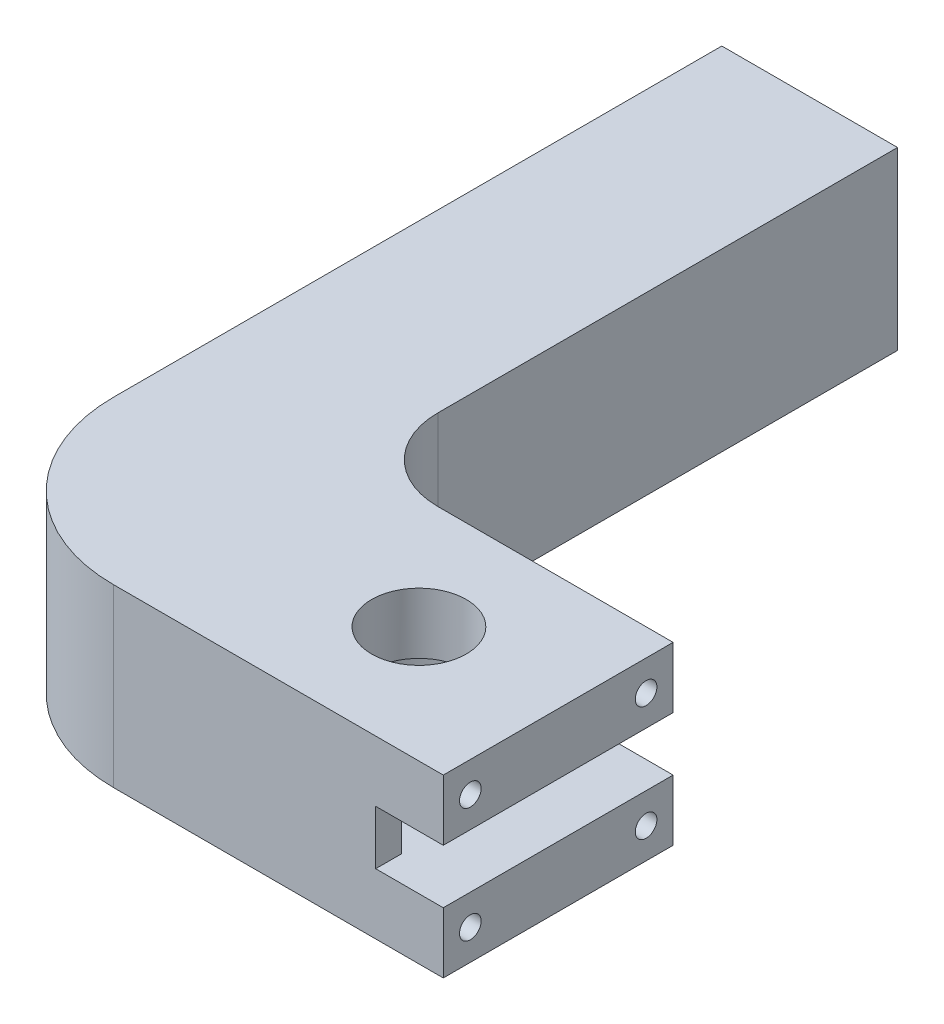
ISO-10303-21;
HEADER;
FILE_DESCRIPTION(('STEP AP214'),'2;1');
FILE_NAME('part.step','',(''),(''),'','','');
FILE_SCHEMA(('AUTOMOTIVE_DESIGN { 1 0 10303 214 1 1 1 1 }'));
ENDSEC;
DATA;
#1=APPLICATION_CONTEXT('core data for automotive mechanical design processes');
#2=APPLICATION_PROTOCOL_DEFINITION('international standard','automotive_design',2000,#1);
#3=PRODUCT_CONTEXT('',#1,'mechanical');
#4=PRODUCT('Part','Part','',(#3));
#5=PRODUCT_RELATED_PRODUCT_CATEGORY('part','',(#4));
#6=PRODUCT_DEFINITION_FORMATION('','',#4);
#7=PRODUCT_DEFINITION_CONTEXT('part definition',#1,'design');
#8=PRODUCT_DEFINITION('design','',#6,#7);
#9=PRODUCT_DEFINITION_SHAPE('','',#8);
#10=(LENGTH_UNIT() NAMED_UNIT(*) SI_UNIT(.MILLI.,.METRE.));
#11=(NAMED_UNIT(*) PLANE_ANGLE_UNIT() SI_UNIT($,.RADIAN.));
#12=(NAMED_UNIT(*) SI_UNIT($,.STERADIAN.) SOLID_ANGLE_UNIT());
#13=UNCERTAINTY_MEASURE_WITH_UNIT(LENGTH_MEASURE(1.E-05),#10,'distance_accuracy_value','');
#14=(GEOMETRIC_REPRESENTATION_CONTEXT(3) GLOBAL_UNCERTAINTY_ASSIGNED_CONTEXT((#13)) GLOBAL_UNIT_ASSIGNED_CONTEXT((#10,
#11,#12)) REPRESENTATION_CONTEXT('',''));
#15=CARTESIAN_POINT('',(0.,0.,0.));
#16=DIRECTION('',(0.,0.,1.));
#17=DIRECTION('',(1.,0.,0.));
#18=AXIS2_PLACEMENT_3D('',#15,#16,#17);
#19=CARTESIAN_POINT('',(3987.8,1.11022302462516E-13,7239.));
#20=DIRECTION('',(1.,0.,0.));
#21=DIRECTION('',(0.,0.,-1.));
#22=AXIS2_PLACEMENT_3D('',#19,#20,#21);
#23=PLANE('',#22);
#24=DIRECTION('',(0.,1.,0.));
#25=VECTOR('',#24,1.);
#26=CARTESIAN_POINT('',(3987.8,1.11022302462516E-13,5080.));
#27=LINE('',#26,#25);
#28=CARTESIAN_POINT('',(3987.8,571.5,5080.));
#29=VERTEX_POINT('',#28);
#30=CARTESIAN_POINT('',(3987.8,1079.5,5080.));
#31=VERTEX_POINT('',#30);
#32=EDGE_CURVE('E277',#29,#31,#27,.T.);
#33=ORIENTED_EDGE('',*,*,#32,.T.);
#34=DIRECTION('',(0.,0.,-1.));
#35=VECTOR('',#34,1.);
#36=CARTESIAN_POINT('',(3987.8,1079.5,5080.));
#37=LINE('',#36,#35);
#38=CARTESIAN_POINT('',(3987.8,1079.5,5321.3));
#39=VERTEX_POINT('',#38);
#40=EDGE_CURVE('E192',#39,#31,#37,.T.);
#41=ORIENTED_EDGE('',*,*,#40,.F.);
#42=DIRECTION('',(0.,-1.,0.));
#43=VECTOR('',#42,1.);
#44=CARTESIAN_POINT('',(3987.8,1079.5,5321.3));
#45=LINE('',#44,#43);
#46=CARTESIAN_POINT('',(3987.8,571.5,5321.3));
#47=VERTEX_POINT('',#46);
#48=EDGE_CURVE('E261',#39,#47,#45,.T.);
#49=ORIENTED_EDGE('',*,*,#48,.T.);
#50=DIRECTION('',(0.,0.,1.));
#51=VECTOR('',#50,1.);
#52=CARTESIAN_POINT('',(3987.8,571.5,7239.));
#53=LINE('',#52,#51);
#54=EDGE_CURVE('E212',#29,#47,#53,.T.);
#55=ORIENTED_EDGE('',*,*,#54,.F.);
#56=EDGE_LOOP('',(#33,#41,#49,#55));
#57=FACE_BOUND('',#56,.T.);
#58=ADVANCED_FACE('F36',(#57),#23,.T.);
#59=DIRECTION('',(0.,-1.,0.));
#60=VECTOR('',#59,1.);
#61=CARTESIAN_POINT('',(3987.8,1079.5,6997.7));
#62=LINE('',#61,#60);
#63=CARTESIAN_POINT('',(3987.8,1079.5,6997.7));
#64=VERTEX_POINT('',#63);
#65=CARTESIAN_POINT('',(3987.8,571.5,6997.7));
#66=VERTEX_POINT('',#65);
#67=EDGE_CURVE('E232',#64,#66,#62,.T.);
#68=ORIENTED_EDGE('',*,*,#67,.F.);
#69=CARTESIAN_POINT('',(3987.8,1079.5,7239.));
#70=VERTEX_POINT('',#69);
#71=EDGE_CURVE('E197',#70,#64,#37,.T.);
#72=ORIENTED_EDGE('',*,*,#71,.F.);
#73=DIRECTION('',(0.,1.,0.));
#74=VECTOR('',#73,1.);
#75=CARTESIAN_POINT('',(3987.8,1.11022302462516E-13,7239.));
#76=LINE('',#75,#74);
#77=CARTESIAN_POINT('',(3987.8,571.5,7239.));
#78=VERTEX_POINT('',#77);
#79=EDGE_CURVE('E163',#78,#70,#76,.T.);
#80=ORIENTED_EDGE('',*,*,#79,.F.);
#81=EDGE_CURVE('E226',#66,#78,#53,.T.);
#82=ORIENTED_EDGE('',*,*,#81,.F.);
#83=EDGE_LOOP('',(#68,#72,#80,#82));
#84=FACE_BOUND('',#83,.T.);
#85=ADVANCED_FACE('F318',(#84),#23,.T.);
#86=CARTESIAN_POINT('',(0.,1.11022302462516E-13,7239.));
#87=DIRECTION('',(0.,0.,1.));
#88=DIRECTION('',(1.,0.,0.));
#89=AXIS2_PLACEMENT_3D('',#86,#87,#88);
#90=PLANE('',#89);
#91=DIRECTION('',(1.,0.,0.));
#92=VECTOR('',#91,1.);
#93=CARTESIAN_POINT('',(3987.8,1651.,7239.));
#94=LINE('',#93,#92);
#95=CARTESIAN_POINT('',(1524.,1651.,7239.));
#96=VERTEX_POINT('',#95);
#97=CARTESIAN_POINT('',(4622.8,1651.,7239.));
#98=VERTEX_POINT('',#97);
#99=EDGE_CURVE('E252',#96,#98,#94,.T.);
#100=ORIENTED_EDGE('',*,*,#99,.F.);
#101=DIRECTION('',(0.,1.,0.));
#102=VECTOR('',#101,1.);
#103=CARTESIAN_POINT('',(1524.,1.11022302462516E-13,7239.));
#104=LINE('',#103,#102);
#105=CARTESIAN_POINT('',(1524.,1.11022302462516E-13,7239.));
#106=VERTEX_POINT('',#105);
#107=EDGE_CURVE('E44',#96,#106,#104,.F.);
#108=ORIENTED_EDGE('',*,*,#107,.T.);
#109=DIRECTION('',(1.,0.,0.));
#110=VECTOR('',#109,1.);
#111=CARTESIAN_POINT('',(0.,1.11022302462516E-13,7239.));
#112=LINE('',#111,#110);
#113=CARTESIAN_POINT('',(4622.8,0.,7239.));
#114=VERTEX_POINT('',#113);
#115=EDGE_CURVE('E273',#106,#114,#112,.T.);
#116=ORIENTED_EDGE('',*,*,#115,.T.);
#117=DIRECTION('',(0.,-1.,0.));
#118=VECTOR('',#117,1.);
#119=CARTESIAN_POINT('',(4622.8,0.,7239.));
#120=LINE('',#119,#118);
#121=CARTESIAN_POINT('',(4622.8,571.5,7239.));
#122=VERTEX_POINT('',#121);
#123=EDGE_CURVE('E213',#122,#114,#120,.T.);
#124=ORIENTED_EDGE('',*,*,#123,.F.);
#125=DIRECTION('',(-1.,0.,0.));
#126=VECTOR('',#125,1.);
#127=CARTESIAN_POINT('',(4622.8,571.5,7239.));
#128=LINE('',#127,#126);
#129=EDGE_CURVE('E223',#122,#78,#128,.T.);
#130=ORIENTED_EDGE('',*,*,#129,.T.);
#131=ORIENTED_EDGE('',*,*,#79,.T.);
#132=DIRECTION('',(-1.,0.,0.));
#133=VECTOR('',#132,1.);
#134=CARTESIAN_POINT('',(4622.8,1079.5,7239.));
#135=LINE('',#134,#133);
#136=CARTESIAN_POINT('',(4622.8,1079.5,7239.));
#137=VERTEX_POINT('',#136);
#138=EDGE_CURVE('E209',#137,#70,#135,.T.);
#139=ORIENTED_EDGE('',*,*,#138,.F.);
#140=DIRECTION('',(0.,-1.,0.));
#141=VECTOR('',#140,1.);
#142=CARTESIAN_POINT('',(4622.8,1079.5,7239.));
#143=LINE('',#142,#141);
#144=EDGE_CURVE('E200',#98,#137,#143,.T.);
#145=ORIENTED_EDGE('',*,*,#144,.F.);
#146=EDGE_LOOP('',(#100,#108,#116,#124,#130,#131,#139,#145));
#147=FACE_BOUND('',#146,.T.);
#148=ADVANCED_FACE('F324',(#147),#90,.T.);
#149=CARTESIAN_POINT('',(0.,1.11022302462516E-13,5080.));
#150=DIRECTION('',(-1.,0.,0.));
#151=DIRECTION('',(0.,0.,1.));
#152=AXIS2_PLACEMENT_3D('',#149,#150,#151);
#153=PLANE('',#152);
#154=DIRECTION('',(0.,0.,1.));
#155=VECTOR('',#154,1.);
#156=CARTESIAN_POINT('',(0.,1.11022302462516E-13,5080.));
#157=LINE('',#156,#155);
#158=CARTESIAN_POINT('',(0.,0.,0.));
#159=VERTEX_POINT('',#158);
#160=CARTESIAN_POINT('',(0.,1.11022302462516E-13,5715.));
#161=VERTEX_POINT('',#160);
#162=EDGE_CURVE('E153',#159,#161,#157,.T.);
#163=ORIENTED_EDGE('',*,*,#162,.T.);
#164=DIRECTION('',(0.,1.,0.));
#165=VECTOR('',#164,1.);
#166=CARTESIAN_POINT('',(0.,1.11022302462516E-13,5715.));
#167=LINE('',#166,#165);
#168=CARTESIAN_POINT('',(0.,1651.,5715.));
#169=VERTEX_POINT('',#168);
#170=EDGE_CURVE('E290',#161,#169,#167,.T.);
#171=ORIENTED_EDGE('',*,*,#170,.T.);
#172=DIRECTION('',(0.,0.,1.));
#173=VECTOR('',#172,1.);
#174=CARTESIAN_POINT('',(0.,1651.,7239.));
#175=LINE('',#174,#173);
#176=CARTESIAN_POINT('',(0.,1651.,0.));
#177=VERTEX_POINT('',#176);
#178=EDGE_CURVE('E169',#177,#169,#175,.T.);
#179=ORIENTED_EDGE('',*,*,#178,.F.);
#180=DIRECTION('',(0.,1.,0.));
#181=VECTOR('',#180,1.);
#182=CARTESIAN_POINT('',(0.,1651.,0.));
#183=LINE('',#182,#181);
#184=EDGE_CURVE('E167',#159,#177,#183,.T.);
#185=ORIENTED_EDGE('',*,*,#184,.F.);
#186=EDGE_LOOP('',(#163,#171,#179,#185));
#187=FACE_BOUND('',#186,.T.);
#188=ADVANCED_FACE('F168',(#187),#153,.T.);
#189=CARTESIAN_POINT('',(3987.8,1.11022302462516E-13,5080.));
#190=DIRECTION('',(0.,0.,-1.));
#191=DIRECTION('',(-1.,0.,0.));
#192=AXIS2_PLACEMENT_3D('',#189,#190,#191);
#193=PLANE('',#192);
#194=DIRECTION('',(-1.,0.,0.));
#195=VECTOR('',#194,1.);
#196=CARTESIAN_POINT('',(3987.8,1.11022302462516E-13,5080.));
#197=LINE('',#196,#195);
#198=CARTESIAN_POINT('',(4622.8,0.,5080.));
#199=VERTEX_POINT('',#198);
#200=CARTESIAN_POINT('',(2413.,1.11022302462516E-13,5080.));
#201=VERTEX_POINT('',#200);
#202=EDGE_CURVE('E164',#199,#201,#197,.T.);
#203=ORIENTED_EDGE('',*,*,#202,.T.);
#204=DIRECTION('',(0.,-1.,0.));
#205=VECTOR('',#204,1.);
#206=CARTESIAN_POINT('',(2413.,1.11022302462516E-13,5080.));
#207=LINE('',#206,#205);
#208=CARTESIAN_POINT('',(2413.,1651.,5080.));
#209=VERTEX_POINT('',#208);
#210=EDGE_CURVE('E284',#201,#209,#207,.F.);
#211=ORIENTED_EDGE('',*,*,#210,.T.);
#212=DIRECTION('',(-1.,0.,0.));
#213=VECTOR('',#212,1.);
#214=CARTESIAN_POINT('',(0.,1651.,5080.));
#215=LINE('',#214,#213);
#216=CARTESIAN_POINT('',(4622.8,1651.,5080.));
#217=VERTEX_POINT('',#216);
#218=EDGE_CURVE('E247',#217,#209,#215,.T.);
#219=ORIENTED_EDGE('',*,*,#218,.F.);
#220=DIRECTION('',(0.,1.,0.));
#221=VECTOR('',#220,1.);
#222=CARTESIAN_POINT('',(4622.8,1651.,5080.));
#223=LINE('',#222,#221);
#224=CARTESIAN_POINT('',(4622.8,1079.5,5080.));
#225=VERTEX_POINT('',#224);
#226=EDGE_CURVE('E193',#225,#217,#223,.T.);
#227=ORIENTED_EDGE('',*,*,#226,.F.);
#228=DIRECTION('',(-1.,0.,0.));
#229=VECTOR('',#228,1.);
#230=CARTESIAN_POINT('',(4622.8,1079.5,5080.));
#231=LINE('',#230,#229);
#232=EDGE_CURVE('E204',#225,#31,#231,.T.);
#233=ORIENTED_EDGE('',*,*,#232,.T.);
#234=ORIENTED_EDGE('',*,*,#32,.F.);
#235=DIRECTION('',(-1.,0.,0.));
#236=VECTOR('',#235,1.);
#237=CARTESIAN_POINT('',(4622.8,571.5,5080.));
#238=LINE('',#237,#236);
#239=CARTESIAN_POINT('',(4622.8,571.5,5080.));
#240=VERTEX_POINT('',#239);
#241=EDGE_CURVE('E229',#240,#29,#238,.T.);
#242=ORIENTED_EDGE('',*,*,#241,.F.);
#243=DIRECTION('',(0.,1.,0.));
#244=VECTOR('',#243,1.);
#245=CARTESIAN_POINT('',(4622.8,571.5,5080.));
#246=LINE('',#245,#244);
#247=EDGE_CURVE('E219',#199,#240,#246,.T.);
#248=ORIENTED_EDGE('',*,*,#247,.F.);
#249=EDGE_LOOP('',(#203,#211,#219,#227,#233,#234,#242,#248));
#250=FACE_BOUND('',#249,.T.);
#251=ADVANCED_FACE('F304',(#250),#193,.T.);
#252=CARTESIAN_POINT('',(0.,1.11022302462516E-13,0.));
#253=DIRECTION('',(0.,1.,0.));
#254=DIRECTION('',(0.,0.,1.));
#255=AXIS2_PLACEMENT_3D('',#252,#253,#254);
#256=PLANE('',#255);
#257=CARTESIAN_POINT('',(3302.,0.,6146.8));
#258=DIRECTION('',(0.,-1.,0.));
#259=DIRECTION('',(0.,0.,-1.));
#260=AXIS2_PLACEMENT_3D('',#257,#258,#259);
#261=CIRCLE('',#260,444.5);
#262=CARTESIAN_POINT('',(3302.,0.,5702.3));
#263=VERTEX_POINT('',#262);
#264=EDGE_CURVE('E392',#263,#263,#261,.T.);
#265=ORIENTED_EDGE('',*,*,#264,.F.);
#266=EDGE_LOOP('',(#265));
#267=FACE_BOUND('',#266,.T.);
#268=ORIENTED_EDGE('',*,*,#115,.F.);
#269=CARTESIAN_POINT('',(1524.,1.11022302462516E-13,5715.));
#270=DIRECTION('',(0.,1.,0.));
#271=DIRECTION('',(0.,0.,1.));
#272=AXIS2_PLACEMENT_3D('',#269,#270,#271);
#273=CIRCLE('',#272,1524.);
#274=EDGE_CURVE('E11',#106,#161,#273,.F.);
#275=ORIENTED_EDGE('',*,*,#274,.T.);
#276=ORIENTED_EDGE('',*,*,#162,.F.);
#277=DIRECTION('',(-1.,0.,0.));
#278=VECTOR('',#277,1.);
#279=CARTESIAN_POINT('',(0.,0.,0.));
#280=LINE('',#279,#278);
#281=CARTESIAN_POINT('',(1651.,0.,0.));
#282=VERTEX_POINT('',#281);
#283=EDGE_CURVE('E158',#282,#159,#280,.T.);
#284=ORIENTED_EDGE('',*,*,#283,.F.);
#285=DIRECTION('',(0.,0.,1.));
#286=VECTOR('',#285,1.);
#287=CARTESIAN_POINT('',(1651.,0.,0.));
#288=LINE('',#287,#286);
#289=CARTESIAN_POINT('',(1651.,0.,4318.));
#290=VERTEX_POINT('',#289);
#291=EDGE_CURVE('E187',#282,#290,#288,.T.);
#292=ORIENTED_EDGE('',*,*,#291,.T.);
#293=CARTESIAN_POINT('',(2413.,1.11022302462516E-13,4318.));
#294=DIRECTION('',(0.,1.,0.));
#295=DIRECTION('',(0.,0.,1.));
#296=AXIS2_PLACEMENT_3D('',#293,#294,#295);
#297=CIRCLE('',#296,762.);
#298=EDGE_CURVE('E286',#290,#201,#297,.T.);
#299=ORIENTED_EDGE('',*,*,#298,.T.);
#300=ORIENTED_EDGE('',*,*,#202,.F.);
#301=DIRECTION('',(0.,0.,-1.));
#302=VECTOR('',#301,1.);
#303=CARTESIAN_POINT('',(4622.8,0.,5080.));
#304=LINE('',#303,#302);
#305=EDGE_CURVE('E216',#114,#199,#304,.T.);
#306=ORIENTED_EDGE('',*,*,#305,.F.);
#307=EDGE_LOOP('',(#268,#275,#276,#284,#292,#299,#300,#306));
#308=FACE_BOUND('',#307,.T.);
#309=ADVANCED_FACE('F155',(#267,#308),#256,.F.);
#310=CARTESIAN_POINT('',(0.,571.5,0.));
#311=DIRECTION('',(0.,1.,0.));
#312=DIRECTION('',(0.,0.,1.));
#313=AXIS2_PLACEMENT_3D('',#310,#311,#312);
#314=PLANE('',#313);
#315=CARTESIAN_POINT('',(3302.,571.5,6146.8));
#316=DIRECTION('',(0.,1.,0.));
#317=DIRECTION('',(0.,0.,1.));
#318=AXIS2_PLACEMENT_3D('',#315,#316,#317);
#319=CIRCLE('',#318,444.5);
#320=CARTESIAN_POINT('',(3302.,571.5,6591.3));
#321=VERTEX_POINT('',#320);
#322=EDGE_CURVE('E389',#321,#321,#319,.T.);
#323=ORIENTED_EDGE('',*,*,#322,.F.);
#324=EDGE_LOOP('',(#323));
#325=FACE_BOUND('',#324,.T.);
#326=DIRECTION('',(1.,0.,0.));
#327=VECTOR('',#326,1.);
#328=CARTESIAN_POINT('',(3987.8,571.5,5321.3));
#329=LINE('',#328,#327);
#330=CARTESIAN_POINT('',(3447.3581439067,571.5,5321.3));
#331=VERTEX_POINT('',#330);
#332=EDGE_CURVE('E259',#331,#47,#329,.T.);
#333=ORIENTED_EDGE('',*,*,#332,.F.);
#334=CARTESIAN_POINT('',(3302.,571.5,6146.8));
#335=DIRECTION('',(0.,-1.,0.));
#336=DIRECTION('',(0.,0.,1.));
#337=AXIS2_PLACEMENT_3D('',#334,#335,#336);
#338=CIRCLE('',#337,838.2);
#339=CARTESIAN_POINT('',(3302.,571.5,6985.));
#340=VERTEX_POINT('',#339);
#341=EDGE_CURVE('E254',#340,#331,#338,.T.);
#342=ORIENTED_EDGE('',*,*,#341,.F.);
#343=DIRECTION('',(0.,0.,-1.));
#344=VECTOR('',#343,1.);
#345=CARTESIAN_POINT('',(3302.,571.5,6997.7));
#346=LINE('',#345,#344);
#347=CARTESIAN_POINT('',(3302.,571.5,6997.7));
#348=VERTEX_POINT('',#347);
#349=EDGE_CURVE('E243',#348,#340,#346,.T.);
#350=ORIENTED_EDGE('',*,*,#349,.F.);
#351=DIRECTION('',(-1.,0.,0.));
#352=VECTOR('',#351,1.);
#353=CARTESIAN_POINT('',(3987.8,571.5,6997.7));
#354=LINE('',#353,#352);
#355=EDGE_CURVE('E235',#66,#348,#354,.T.);
#356=ORIENTED_EDGE('',*,*,#355,.F.);
#357=ORIENTED_EDGE('',*,*,#81,.T.);
#358=ORIENTED_EDGE('',*,*,#129,.F.);
#359=DIRECTION('',(0.,0.,1.));
#360=VECTOR('',#359,1.);
#361=CARTESIAN_POINT('',(4622.8,571.5,7239.));
#362=LINE('',#361,#360);
#363=EDGE_CURVE('E221',#240,#122,#362,.T.);
#364=ORIENTED_EDGE('',*,*,#363,.F.);
#365=ORIENTED_EDGE('',*,*,#241,.T.);
#366=ORIENTED_EDGE('',*,*,#54,.T.);
#367=EDGE_LOOP('',(#333,#342,#350,#356,#357,#358,#364,#365,#366));
#368=FACE_BOUND('',#367,.T.);
#369=ADVANCED_FACE('F348',(#325,#368),#314,.T.);
#370=CARTESIAN_POINT('',(3302.,1079.5,6146.8));
#371=DIRECTION('',(0.,-1.,0.));
#372=DIRECTION('',(0.,0.,-1.));
#373=AXIS2_PLACEMENT_3D('',#370,#371,#372);
#374=CYLINDRICAL_SURFACE('',#373,838.2);
#375=ORIENTED_EDGE('',*,*,#341,.T.);
#376=DIRECTION('',(0.,-1.,0.));
#377=VECTOR('',#376,1.);
#378=CARTESIAN_POINT('',(3447.3581439067,1079.5,5321.3));
#379=LINE('',#378,#377);
#380=CARTESIAN_POINT('',(3447.3581439067,1079.5,5321.3));
#381=VERTEX_POINT('',#380);
#382=EDGE_CURVE('E267',#381,#331,#379,.T.);
#383=ORIENTED_EDGE('',*,*,#382,.F.);
#384=CARTESIAN_POINT('',(3302.,1079.5,6146.8));
#385=DIRECTION('',(0.,-1.,0.));
#386=DIRECTION('',(0.,0.,1.));
#387=AXIS2_PLACEMENT_3D('',#384,#385,#386);
#388=CIRCLE('',#387,838.2);
#389=CARTESIAN_POINT('',(3302.,1079.5,6985.));
#390=VERTEX_POINT('',#389);
#391=EDGE_CURVE('E255',#390,#381,#388,.T.);
#392=ORIENTED_EDGE('',*,*,#391,.F.);
#393=DIRECTION('',(0.,-1.,0.));
#394=VECTOR('',#393,1.);
#395=CARTESIAN_POINT('',(3302.,1079.5,6985.));
#396=LINE('',#395,#394);
#397=EDGE_CURVE('E270',#390,#340,#396,.T.);
#398=ORIENTED_EDGE('',*,*,#397,.T.);
#399=EDGE_LOOP('',(#375,#383,#392,#398));
#400=FACE_BOUND('',#399,.T.);
#401=ADVANCED_FACE('F366',(#400),#374,.F.);
#402=CARTESIAN_POINT('',(3987.8,1079.5,5321.3));
#403=DIRECTION('',(0.,0.,-1.));
#404=DIRECTION('',(-1.,0.,0.));
#405=AXIS2_PLACEMENT_3D('',#402,#403,#404);
#406=PLANE('',#405);
#407=ORIENTED_EDGE('',*,*,#332,.T.);
#408=ORIENTED_EDGE('',*,*,#48,.F.);
#409=DIRECTION('',(1.,0.,0.));
#410=VECTOR('',#409,1.);
#411=CARTESIAN_POINT('',(3987.8,1079.5,5321.3));
#412=LINE('',#411,#410);
#413=EDGE_CURVE('E258',#381,#39,#412,.T.);
#414=ORIENTED_EDGE('',*,*,#413,.F.);
#415=ORIENTED_EDGE('',*,*,#382,.T.);
#416=EDGE_LOOP('',(#407,#408,#414,#415));
#417=FACE_BOUND('',#416,.T.);
#418=ADVANCED_FACE('F368',(#417),#406,.F.);
#419=CARTESIAN_POINT('',(0.,1651.,0.));
#420=DIRECTION('',(0.,-1.,0.));
#421=DIRECTION('',(0.,0.,-1.));
#422=AXIS2_PLACEMENT_3D('',#419,#420,#421);
#423=PLANE('',#422);
#424=CARTESIAN_POINT('',(3302.,1651.,6146.8));
#425=DIRECTION('',(0.,1.,0.));
#426=DIRECTION('',(0.,0.,1.));
#427=AXIS2_PLACEMENT_3D('',#424,#425,#426);
#428=CIRCLE('',#427,444.5);
#429=CARTESIAN_POINT('',(3302.,1651.,6591.3));
#430=VERTEX_POINT('',#429);
#431=EDGE_CURVE('E445',#430,#430,#428,.T.);
#432=ORIENTED_EDGE('',*,*,#431,.F.);
#433=EDGE_LOOP('',(#432));
#434=FACE_BOUND('',#433,.T.);
#435=ORIENTED_EDGE('',*,*,#178,.T.);
#436=CARTESIAN_POINT('',(1524.,1651.,5715.));
#437=DIRECTION('',(0.,-1.,0.));
#438=DIRECTION('',(0.,0.,-1.));
#439=AXIS2_PLACEMENT_3D('',#436,#437,#438);
#440=CIRCLE('',#439,1524.);
#441=EDGE_CURVE('E58',#169,#96,#440,.F.);
#442=ORIENTED_EDGE('',*,*,#441,.T.);
#443=ORIENTED_EDGE('',*,*,#99,.T.);
#444=DIRECTION('',(0.,0.,1.));
#445=VECTOR('',#444,1.);
#446=CARTESIAN_POINT('',(4622.8,1651.,7239.));
#447=LINE('',#446,#445);
#448=EDGE_CURVE('E196',#217,#98,#447,.T.);
#449=ORIENTED_EDGE('',*,*,#448,.F.);
#450=ORIENTED_EDGE('',*,*,#218,.T.);
#451=CARTESIAN_POINT('',(2413.,1651.,4318.));
#452=DIRECTION('',(0.,-1.,0.));
#453=DIRECTION('',(0.,0.,-1.));
#454=AXIS2_PLACEMENT_3D('',#451,#452,#453);
#455=CIRCLE('',#454,762.);
#456=CARTESIAN_POINT('',(1651.,1651.,4318.));
#457=VERTEX_POINT('',#456);
#458=EDGE_CURVE('E288',#209,#457,#455,.T.);
#459=ORIENTED_EDGE('',*,*,#458,.T.);
#460=DIRECTION('',(0.,0.,1.));
#461=VECTOR('',#460,1.);
#462=CARTESIAN_POINT('',(1651.,1651.,0.));
#463=LINE('',#462,#461);
#464=CARTESIAN_POINT('',(1651.,1651.,0.));
#465=VERTEX_POINT('',#464);
#466=EDGE_CURVE('E189',#465,#457,#463,.T.);
#467=ORIENTED_EDGE('',*,*,#466,.F.);
#468=DIRECTION('',(1.,0.,0.));
#469=VECTOR('',#468,1.);
#470=CARTESIAN_POINT('',(1651.,1651.,0.));
#471=LINE('',#470,#469);
#472=EDGE_CURVE('E172',#177,#465,#471,.T.);
#473=ORIENTED_EDGE('',*,*,#472,.F.);
#474=EDGE_LOOP('',(#435,#442,#443,#449,#450,#459,#467,#473));
#475=FACE_BOUND('',#474,.T.);
#476=ADVANCED_FACE('F293',(#434,#475),#423,.F.);
#477=CARTESIAN_POINT('',(0.,1079.5,0.));
#478=DIRECTION('',(0.,-1.,0.));
#479=DIRECTION('',(0.,0.,-1.));
#480=AXIS2_PLACEMENT_3D('',#477,#478,#479);
#481=PLANE('',#480);
#482=CARTESIAN_POINT('',(3302.,1079.5,6146.8));
#483=DIRECTION('',(0.,-1.,0.));
#484=DIRECTION('',(0.,0.,-1.));
#485=AXIS2_PLACEMENT_3D('',#482,#483,#484);
#486=CIRCLE('',#485,444.5);
#487=CARTESIAN_POINT('',(3302.,1079.5,5702.3));
#488=VERTEX_POINT('',#487);
#489=EDGE_CURVE('E398',#488,#488,#486,.T.);
#490=ORIENTED_EDGE('',*,*,#489,.F.);
#491=EDGE_LOOP('',(#490));
#492=FACE_BOUND('',#491,.T.);
#493=ORIENTED_EDGE('',*,*,#413,.T.);
#494=ORIENTED_EDGE('',*,*,#40,.T.);
#495=ORIENTED_EDGE('',*,*,#232,.F.);
#496=DIRECTION('',(0.,0.,-1.));
#497=VECTOR('',#496,1.);
#498=CARTESIAN_POINT('',(4622.8,1079.5,5080.));
#499=LINE('',#498,#497);
#500=EDGE_CURVE('E202',#137,#225,#499,.T.);
#501=ORIENTED_EDGE('',*,*,#500,.F.);
#502=ORIENTED_EDGE('',*,*,#138,.T.);
#503=ORIENTED_EDGE('',*,*,#71,.T.);
#504=DIRECTION('',(1.,0.,0.));
#505=VECTOR('',#504,1.);
#506=CARTESIAN_POINT('',(3302.,1079.5,6997.7));
#507=LINE('',#506,#505);
#508=CARTESIAN_POINT('',(3302.,1079.5,6997.7));
#509=VERTEX_POINT('',#508);
#510=EDGE_CURVE('E241',#509,#64,#507,.T.);
#511=ORIENTED_EDGE('',*,*,#510,.F.);
#512=DIRECTION('',(0.,0.,-1.));
#513=VECTOR('',#512,1.);
#514=CARTESIAN_POINT('',(3302.,1079.5,6997.7));
#515=LINE('',#514,#513);
#516=EDGE_CURVE('E244',#509,#390,#515,.T.);
#517=ORIENTED_EDGE('',*,*,#516,.T.);
#518=ORIENTED_EDGE('',*,*,#391,.T.);
#519=EDGE_LOOP('',(#493,#494,#495,#501,#502,#503,#511,#517,#518));
#520=FACE_BOUND('',#519,.T.);
#521=ADVANCED_FACE('F343',(#492,#520),#481,.T.);
#522=CARTESIAN_POINT('',(3302.,571.5,6997.7));
#523=DIRECTION('',(-1.,0.,0.));
#524=DIRECTION('',(0.,0.,1.));
#525=AXIS2_PLACEMENT_3D('',#522,#523,#524);
#526=PLANE('',#525);
#527=ORIENTED_EDGE('',*,*,#397,.F.);
#528=ORIENTED_EDGE('',*,*,#516,.F.);
#529=DIRECTION('',(0.,1.,0.));
#530=VECTOR('',#529,1.);
#531=CARTESIAN_POINT('',(3302.,571.5,6997.7));
#532=LINE('',#531,#530);
#533=EDGE_CURVE('E238',#348,#509,#532,.T.);
#534=ORIENTED_EDGE('',*,*,#533,.F.);
#535=ORIENTED_EDGE('',*,*,#349,.T.);
#536=EDGE_LOOP('',(#527,#528,#534,#535));
#537=FACE_BOUND('',#536,.T.);
#538=ADVANCED_FACE('F363',(#537),#526,.F.);
#539=CARTESIAN_POINT('',(0.,0.,6997.7));
#540=DIRECTION('',(0.,0.,-1.));
#541=DIRECTION('',(-1.,0.,0.));
#542=AXIS2_PLACEMENT_3D('',#539,#540,#541);
#543=PLANE('',#542);
#544=ORIENTED_EDGE('',*,*,#67,.T.);
#545=ORIENTED_EDGE('',*,*,#355,.T.);
#546=ORIENTED_EDGE('',*,*,#533,.T.);
#547=ORIENTED_EDGE('',*,*,#510,.T.);
#548=EDGE_LOOP('',(#544,#545,#546,#547));
#549=FACE_BOUND('',#548,.T.);
#550=ADVANCED_FACE('F360',(#549),#543,.T.);
#551=CARTESIAN_POINT('',(4622.8,0.,0.));
#552=DIRECTION('',(-1.,0.,0.));
#553=DIRECTION('',(0.,0.,1.));
#554=AXIS2_PLACEMENT_3D('',#551,#552,#553);
#555=PLANE('',#554);
#556=CARTESIAN_POINT('',(4622.8,285.75,6985.));
#557=DIRECTION('',(1.,0.,0.));
#558=DIRECTION('',(0.,0.,-1.));
#559=AXIS2_PLACEMENT_3D('',#556,#557,#558);
#560=CIRCLE('',#559,101.6);
#561=CARTESIAN_POINT('',(4622.8,285.75,6883.4));
#562=VERTEX_POINT('',#561);
#563=EDGE_CURVE('E391',#562,#562,#560,.T.);
#564=ORIENTED_EDGE('',*,*,#563,.F.);
#565=EDGE_LOOP('',(#564));
#566=FACE_BOUND('',#565,.T.);
#567=CARTESIAN_POINT('',(4622.8,285.75,5334.));
#568=DIRECTION('',(1.,0.,0.));
#569=DIRECTION('',(0.,0.,-1.));
#570=AXIS2_PLACEMENT_3D('',#567,#568,#569);
#571=CIRCLE('',#570,101.6);
#572=CARTESIAN_POINT('',(4622.8,285.75,5232.4));
#573=VERTEX_POINT('',#572);
#574=EDGE_CURVE('E404',#573,#573,#571,.T.);
#575=ORIENTED_EDGE('',*,*,#574,.F.);
#576=EDGE_LOOP('',(#575));
#577=FACE_BOUND('',#576,.T.);
#578=ORIENTED_EDGE('',*,*,#123,.T.);
#579=ORIENTED_EDGE('',*,*,#305,.T.);
#580=ORIENTED_EDGE('',*,*,#247,.T.);
#581=ORIENTED_EDGE('',*,*,#363,.T.);
#582=EDGE_LOOP('',(#578,#579,#580,#581));
#583=FACE_BOUND('',#582,.T.);
#584=ADVANCED_FACE('F355',(#566,#577,#583),#555,.F.);
#585=CARTESIAN_POINT('',(4622.8,0.,0.));
#586=DIRECTION('',(-1.,0.,0.));
#587=DIRECTION('',(0.,0.,1.));
#588=AXIS2_PLACEMENT_3D('',#585,#586,#587);
#589=PLANE('',#588);
#590=CARTESIAN_POINT('',(4622.8,1365.25,5334.));
#591=DIRECTION('',(1.,0.,0.));
#592=DIRECTION('',(0.,0.,-1.));
#593=AXIS2_PLACEMENT_3D('',#590,#591,#592);
#594=CIRCLE('',#593,101.6);
#595=CARTESIAN_POINT('',(4622.8,1365.25,5232.4));
#596=VERTEX_POINT('',#595);
#597=EDGE_CURVE('E410',#596,#596,#594,.T.);
#598=ORIENTED_EDGE('',*,*,#597,.F.);
#599=EDGE_LOOP('',(#598));
#600=FACE_BOUND('',#599,.T.);
#601=CARTESIAN_POINT('',(4622.8,1365.25,6985.));
#602=DIRECTION('',(1.,0.,0.));
#603=DIRECTION('',(0.,0.,-1.));
#604=AXIS2_PLACEMENT_3D('',#601,#602,#603);
#605=CIRCLE('',#604,101.6);
#606=CARTESIAN_POINT('',(4622.8,1365.25,6883.4));
#607=VERTEX_POINT('',#606);
#608=EDGE_CURVE('E181',#607,#607,#605,.T.);
#609=ORIENTED_EDGE('',*,*,#608,.F.);
#610=EDGE_LOOP('',(#609));
#611=FACE_BOUND('',#610,.T.);
#612=ORIENTED_EDGE('',*,*,#226,.T.);
#613=ORIENTED_EDGE('',*,*,#448,.T.);
#614=ORIENTED_EDGE('',*,*,#144,.T.);
#615=ORIENTED_EDGE('',*,*,#500,.T.);
#616=EDGE_LOOP('',(#612,#613,#614,#615));
#617=FACE_BOUND('',#616,.T.);
#618=ADVANCED_FACE('F336',(#600,#611,#617),#589,.F.);
#619=CARTESIAN_POINT('',(1651.,0.,0.));
#620=DIRECTION('',(-1.,0.,0.));
#621=DIRECTION('',(0.,0.,1.));
#622=AXIS2_PLACEMENT_3D('',#619,#620,#621);
#623=PLANE('',#622);
#624=ORIENTED_EDGE('',*,*,#466,.T.);
#625=DIRECTION('',(0.,-1.,0.));
#626=VECTOR('',#625,1.);
#627=CARTESIAN_POINT('',(1651.,0.,4318.));
#628=LINE('',#627,#626);
#629=EDGE_CURVE('E281',#457,#290,#628,.T.);
#630=ORIENTED_EDGE('',*,*,#629,.T.);
#631=ORIENTED_EDGE('',*,*,#291,.F.);
#632=DIRECTION('',(0.,-1.,0.));
#633=VECTOR('',#632,1.);
#634=CARTESIAN_POINT('',(1651.,0.,0.));
#635=LINE('',#634,#633);
#636=EDGE_CURVE('E176',#465,#282,#635,.T.);
#637=ORIENTED_EDGE('',*,*,#636,.F.);
#638=EDGE_LOOP('',(#624,#630,#631,#637));
#639=FACE_BOUND('',#638,.T.);
#640=ADVANCED_FACE('F298',(#639),#623,.F.);
#641=CARTESIAN_POINT('',(0.,0.,0.));
#642=DIRECTION('',(0.,0.,1.));
#643=DIRECTION('',(1.,0.,0.));
#644=AXIS2_PLACEMENT_3D('',#641,#642,#643);
#645=PLANE('',#644);
#646=ORIENTED_EDGE('',*,*,#283,.T.);
#647=ORIENTED_EDGE('',*,*,#184,.T.);
#648=ORIENTED_EDGE('',*,*,#472,.T.);
#649=ORIENTED_EDGE('',*,*,#636,.T.);
#650=EDGE_LOOP('',(#646,#647,#648,#649));
#651=FACE_BOUND('',#650,.T.);
#652=ADVANCED_FACE('F174',(#651),#645,.F.);
#653=CARTESIAN_POINT('',(4114.8,1365.25,6985.));
#654=DIRECTION('',(-1.,0.,0.));
#655=DIRECTION('',(0.,0.,1.));
#656=AXIS2_PLACEMENT_3D('',#653,#654,#655);
#657=PLANE('',#656);
#658=CARTESIAN_POINT('',(4114.8,1365.25,6985.));
#659=DIRECTION('',(1.,0.,0.));
#660=DIRECTION('',(0.,0.,-1.));
#661=AXIS2_PLACEMENT_3D('',#658,#659,#660);
#662=CIRCLE('',#661,101.6);
#663=CARTESIAN_POINT('',(4114.8,1365.25,6883.4));
#664=VERTEX_POINT('',#663);
#665=EDGE_CURVE('E178',#664,#664,#662,.T.);
#666=ORIENTED_EDGE('',*,*,#665,.T.);
#667=EDGE_LOOP('',(#666));
#668=FACE_BOUND('',#667,.T.);
#669=ADVANCED_FACE('F548',(#668),#657,.F.);
#670=CARTESIAN_POINT('',(4622.8,1365.25,6985.));
#671=DIRECTION('',(1.,0.,0.));
#672=DIRECTION('',(0.,0.,-1.));
#673=AXIS2_PLACEMENT_3D('',#670,#671,#672);
#674=CYLINDRICAL_SURFACE('',#673,101.6);
#675=ORIENTED_EDGE('',*,*,#665,.F.);
#676=EDGE_LOOP('',(#675));
#677=FACE_BOUND('',#676,.T.);
#678=ORIENTED_EDGE('',*,*,#608,.T.);
#679=EDGE_LOOP('',(#678));
#680=FACE_BOUND('',#679,.T.);
#681=ADVANCED_FACE('F418',(#677,#680),#674,.F.);
#682=CARTESIAN_POINT('',(4114.8,1365.25,5334.));
#683=DIRECTION('',(-1.,0.,0.));
#684=DIRECTION('',(0.,0.,1.));
#685=AXIS2_PLACEMENT_3D('',#682,#683,#684);
#686=PLANE('',#685);
#687=CARTESIAN_POINT('',(4114.8,1365.25,5334.));
#688=DIRECTION('',(1.,0.,0.));
#689=DIRECTION('',(0.,0.,-1.));
#690=AXIS2_PLACEMENT_3D('',#687,#688,#689);
#691=CIRCLE('',#690,101.6);
#692=CARTESIAN_POINT('',(4114.8,1365.25,5232.4));
#693=VERTEX_POINT('',#692);
#694=EDGE_CURVE('E413',#693,#693,#691,.T.);
#695=ORIENTED_EDGE('',*,*,#694,.T.);
#696=EDGE_LOOP('',(#695));
#697=FACE_BOUND('',#696,.T.);
#698=ADVANCED_FACE('F531',(#697),#686,.F.);
#699=CARTESIAN_POINT('',(4622.8,1365.25,5334.));
#700=DIRECTION('',(1.,0.,0.));
#701=DIRECTION('',(0.,0.,-1.));
#702=AXIS2_PLACEMENT_3D('',#699,#700,#701);
#703=CYLINDRICAL_SURFACE('',#702,101.6);
#704=ORIENTED_EDGE('',*,*,#694,.F.);
#705=EDGE_LOOP('',(#704));
#706=FACE_BOUND('',#705,.T.);
#707=ORIENTED_EDGE('',*,*,#597,.T.);
#708=EDGE_LOOP('',(#707));
#709=FACE_BOUND('',#708,.T.);
#710=ADVANCED_FACE('F522',(#706,#709),#703,.F.);
#711=CARTESIAN_POINT('',(4114.8,285.75,5334.));
#712=DIRECTION('',(-1.,0.,0.));
#713=DIRECTION('',(0.,0.,1.));
#714=AXIS2_PLACEMENT_3D('',#711,#712,#713);
#715=PLANE('',#714);
#716=CARTESIAN_POINT('',(4114.8,285.75,5334.));
#717=DIRECTION('',(1.,0.,0.));
#718=DIRECTION('',(0.,0.,-1.));
#719=AXIS2_PLACEMENT_3D('',#716,#717,#718);
#720=CIRCLE('',#719,101.6);
#721=CARTESIAN_POINT('',(4114.8,285.75,5232.4));
#722=VERTEX_POINT('',#721);
#723=EDGE_CURVE('E407',#722,#722,#720,.T.);
#724=ORIENTED_EDGE('',*,*,#723,.T.);
#725=EDGE_LOOP('',(#724));
#726=FACE_BOUND('',#725,.T.);
#727=ADVANCED_FACE('F513',(#726),#715,.F.);
#728=CARTESIAN_POINT('',(4622.8,285.75,5334.));
#729=DIRECTION('',(1.,0.,0.));
#730=DIRECTION('',(0.,0.,-1.));
#731=AXIS2_PLACEMENT_3D('',#728,#729,#730);
#732=CYLINDRICAL_SURFACE('',#731,101.6);
#733=ORIENTED_EDGE('',*,*,#723,.F.);
#734=EDGE_LOOP('',(#733));
#735=FACE_BOUND('',#734,.T.);
#736=ORIENTED_EDGE('',*,*,#574,.T.);
#737=EDGE_LOOP('',(#736));
#738=FACE_BOUND('',#737,.T.);
#739=ADVANCED_FACE('F504',(#735,#738),#732,.F.);
#740=CARTESIAN_POINT('',(4114.8,285.75,6985.));
#741=DIRECTION('',(-1.,0.,0.));
#742=DIRECTION('',(0.,0.,1.));
#743=AXIS2_PLACEMENT_3D('',#740,#741,#742);
#744=PLANE('',#743);
#745=CARTESIAN_POINT('',(4114.8,285.75,6985.));
#746=DIRECTION('',(1.,0.,0.));
#747=DIRECTION('',(0.,0.,-1.));
#748=AXIS2_PLACEMENT_3D('',#745,#746,#747);
#749=CIRCLE('',#748,101.6);
#750=CARTESIAN_POINT('',(4114.8,285.75,6883.4));
#751=VERTEX_POINT('',#750);
#752=EDGE_CURVE('E395',#751,#751,#749,.T.);
#753=ORIENTED_EDGE('',*,*,#752,.T.);
#754=EDGE_LOOP('',(#753));
#755=FACE_BOUND('',#754,.T.);
#756=ADVANCED_FACE('F495',(#755),#744,.F.);
#757=CARTESIAN_POINT('',(4622.8,285.75,6985.));
#758=DIRECTION('',(1.,0.,0.));
#759=DIRECTION('',(0.,0.,-1.));
#760=AXIS2_PLACEMENT_3D('',#757,#758,#759);
#761=CYLINDRICAL_SURFACE('',#760,101.6);
#762=ORIENTED_EDGE('',*,*,#752,.F.);
#763=EDGE_LOOP('',(#762));
#764=FACE_BOUND('',#763,.T.);
#765=ORIENTED_EDGE('',*,*,#563,.T.);
#766=EDGE_LOOP('',(#765));
#767=FACE_BOUND('',#766,.T.);
#768=ADVANCED_FACE('F486',(#764,#767),#761,.F.);
#769=CARTESIAN_POINT('',(3302.,0.,6146.8));
#770=DIRECTION('',(0.,-1.,0.));
#771=DIRECTION('',(0.,0.,-1.));
#772=AXIS2_PLACEMENT_3D('',#769,#770,#771);
#773=CYLINDRICAL_SURFACE('',#772,444.5);
#774=ORIENTED_EDGE('',*,*,#264,.T.);
#775=EDGE_LOOP('',(#774));
#776=FACE_BOUND('',#775,.T.);
#777=ORIENTED_EDGE('',*,*,#322,.T.);
#778=EDGE_LOOP('',(#777));
#779=FACE_BOUND('',#778,.T.);
#780=ADVANCED_FACE('F313',(#776,#779),#773,.F.);
#781=CARTESIAN_POINT('',(3302.,1651.,6146.8));
#782=DIRECTION('',(0.,1.,0.));
#783=DIRECTION('',(0.,0.,1.));
#784=AXIS2_PLACEMENT_3D('',#781,#782,#783);
#785=CYLINDRICAL_SURFACE('',#784,444.5);
#786=ORIENTED_EDGE('',*,*,#431,.T.);
#787=EDGE_LOOP('',(#786));
#788=FACE_BOUND('',#787,.T.);
#789=ORIENTED_EDGE('',*,*,#489,.T.);
#790=EDGE_LOOP('',(#789));
#791=FACE_BOUND('',#790,.T.);
#792=ADVANCED_FACE('F308',(#788,#791),#785,.F.);
#793=CARTESIAN_POINT('',(2413.,0.,4318.));
#794=DIRECTION('',(0.,-1.,0.));
#795=DIRECTION('',(0.,0.,-1.));
#796=AXIS2_PLACEMENT_3D('',#793,#794,#795);
#797=CYLINDRICAL_SURFACE('',#796,762.);
#798=ORIENTED_EDGE('',*,*,#458,.F.);
#799=ORIENTED_EDGE('',*,*,#210,.F.);
#800=ORIENTED_EDGE('',*,*,#298,.F.);
#801=ORIENTED_EDGE('',*,*,#629,.F.);
#802=EDGE_LOOP('',(#798,#799,#800,#801));
#803=FACE_BOUND('',#802,.T.);
#804=ADVANCED_FACE('F306',(#803),#797,.F.);
#805=CARTESIAN_POINT('',(1524.,1.11022302462516E-13,5715.));
#806=DIRECTION('',(0.,1.,0.));
#807=DIRECTION('',(0.,0.,1.));
#808=AXIS2_PLACEMENT_3D('',#805,#806,#807);
#809=CYLINDRICAL_SURFACE('',#808,1524.);
#810=ORIENTED_EDGE('',*,*,#274,.F.);
#811=ORIENTED_EDGE('',*,*,#107,.F.);
#812=ORIENTED_EDGE('',*,*,#441,.F.);
#813=ORIENTED_EDGE('',*,*,#170,.F.);
#814=EDGE_LOOP('',(#810,#811,#812,#813));
#815=FACE_BOUND('',#814,.T.);
#816=ADVANCED_FACE('F38',(#815),#809,.T.);
#817=CLOSED_SHELL('',(#58,#85,#148,#188,#251,#309,#369,#401,#418,#476,#521,#538,#550,#584,#618,
#640,#652,#669,#681,#698,#710,#727,#739,#756,#768,#780,#792,#804,#816));
#818=MANIFOLD_SOLID_BREP('B2',#817);
#819=ADVANCED_BREP_SHAPE_REPRESENTATION('',(#18,#818),#14);
#820=SHAPE_DEFINITION_REPRESENTATION(#9,#819);
ENDSEC;
END-ISO-10303-21;
